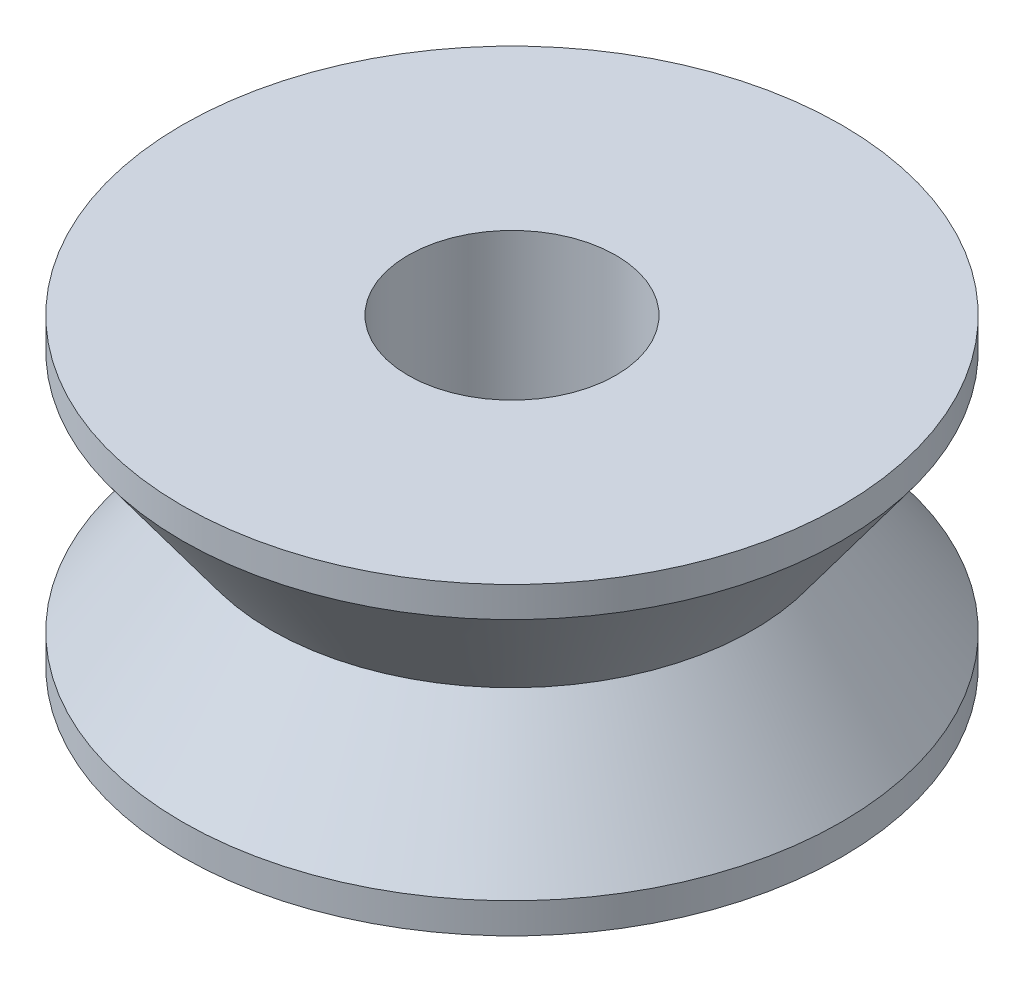
ISO-10303-21;
HEADER;
FILE_DESCRIPTION(('STEP AP214'),'2;1');
FILE_NAME('part.step','',(''),(''),'','','');
FILE_SCHEMA(('AUTOMOTIVE_DESIGN { 1 0 10303 214 1 1 1 1 }'));
ENDSEC;
DATA;
#1=APPLICATION_CONTEXT('core data for automotive mechanical design processes');
#2=APPLICATION_PROTOCOL_DEFINITION('international standard','automotive_design',2000,#1);
#3=PRODUCT_CONTEXT('',#1,'mechanical');
#4=PRODUCT('Part','Part','',(#3));
#5=PRODUCT_RELATED_PRODUCT_CATEGORY('part','',(#4));
#6=PRODUCT_DEFINITION_FORMATION('','',#4);
#7=PRODUCT_DEFINITION_CONTEXT('part definition',#1,'design');
#8=PRODUCT_DEFINITION('design','',#6,#7);
#9=PRODUCT_DEFINITION_SHAPE('','',#8);
#10=(LENGTH_UNIT() NAMED_UNIT(*) SI_UNIT(.MILLI.,.METRE.));
#11=(NAMED_UNIT(*) PLANE_ANGLE_UNIT() SI_UNIT($,.RADIAN.));
#12=(NAMED_UNIT(*) SI_UNIT($,.STERADIAN.) SOLID_ANGLE_UNIT());
#13=UNCERTAINTY_MEASURE_WITH_UNIT(LENGTH_MEASURE(1.E-05),#10,'distance_accuracy_value','');
#14=(GEOMETRIC_REPRESENTATION_CONTEXT(3) GLOBAL_UNCERTAINTY_ASSIGNED_CONTEXT((#13)) GLOBAL_UNIT_ASSIGNED_CONTEXT((#10,
#11,#12)) REPRESENTATION_CONTEXT('',''));
#15=CARTESIAN_POINT('',(0.,0.,0.));
#16=DIRECTION('',(0.,0.,1.));
#17=DIRECTION('',(1.,0.,0.));
#18=AXIS2_PLACEMENT_3D('',#15,#16,#17);
#19=CARTESIAN_POINT('',(0.,6.,0.));
#20=DIRECTION('',(0.,1.,0.));
#21=DIRECTION('',(0.,0.,1.));
#22=AXIS2_PLACEMENT_3D('',#19,#20,#21);
#23=PLANE('',#22);
#24=CARTESIAN_POINT('',(0.,6.,0.));
#25=DIRECTION('',(0.,1.,0.));
#26=DIRECTION('',(0.,0.,1.));
#27=AXIS2_PLACEMENT_3D('',#24,#25,#26);
#28=CIRCLE('',#27,2.05);
#29=CARTESIAN_POINT('',(0.,6.,2.05));
#30=VERTEX_POINT('',#29);
#31=EDGE_CURVE('E57',#30,#30,#28,.T.);
#32=ORIENTED_EDGE('',*,*,#31,.F.);
#33=EDGE_LOOP('',(#32));
#34=FACE_BOUND('',#33,.T.);
#35=CARTESIAN_POINT('',(0.,6.,0.));
#36=DIRECTION('',(0.,-1.,0.));
#37=DIRECTION('',(0.,0.,-1.));
#38=AXIS2_PLACEMENT_3D('',#35,#36,#37);
#39=CIRCLE('',#38,6.5);
#40=CARTESIAN_POINT('',(0.,6.,-6.5));
#41=VERTEX_POINT('',#40);
#42=EDGE_CURVE('E10',#41,#41,#39,.T.);
#43=ORIENTED_EDGE('',*,*,#42,.F.);
#44=EDGE_LOOP('',(#43));
#45=FACE_BOUND('',#44,.T.);
#46=ADVANCED_FACE('F35',(#34,#45),#23,.T.);
#47=CARTESIAN_POINT('',(0.,0.,0.));
#48=DIRECTION('',(0.,-1.,0.));
#49=DIRECTION('',(0.,0.,-1.));
#50=AXIS2_PLACEMENT_3D('',#47,#48,#49);
#51=CYLINDRICAL_SURFACE('',#50,6.5);
#52=ORIENTED_EDGE('',*,*,#42,.T.);
#53=EDGE_LOOP('',(#52));
#54=FACE_BOUND('',#53,.T.);
#55=CARTESIAN_POINT('',(0.,5.4,0.));
#56=DIRECTION('',(0.,-1.,0.));
#57=DIRECTION('',(0.,0.,-1.));
#58=AXIS2_PLACEMENT_3D('',#55,#56,#57);
#59=CIRCLE('',#58,6.5);
#60=CARTESIAN_POINT('',(0.,5.4,-6.5));
#61=VERTEX_POINT('',#60);
#62=EDGE_CURVE('E41',#61,#61,#59,.T.);
#63=ORIENTED_EDGE('',*,*,#62,.F.);
#64=EDGE_LOOP('',(#63));
#65=FACE_BOUND('',#64,.T.);
#66=ADVANCED_FACE('F68',(#54,#65),#51,.T.);
#67=CARTESIAN_POINT('',(0.,3.,0.));
#68=DIRECTION('',(0.,1.,0.));
#69=DIRECTION('',(0.,0.,1.));
#70=AXIS2_PLACEMENT_3D('',#67,#68,#69);
#71=CONICAL_SURFACE('',#70,4.75,0.630033909545915);
#72=ORIENTED_EDGE('',*,*,#62,.T.);
#73=EDGE_LOOP('',(#72));
#74=FACE_BOUND('',#73,.T.);
#75=CARTESIAN_POINT('',(0.,3.,0.));
#76=DIRECTION('',(0.,-1.,0.));
#77=DIRECTION('',(0.,0.,-1.));
#78=AXIS2_PLACEMENT_3D('',#75,#76,#77);
#79=CIRCLE('',#78,4.75);
#80=CARTESIAN_POINT('',(0.,3.,-4.75));
#81=VERTEX_POINT('',#80);
#82=EDGE_CURVE('E45',#81,#81,#79,.T.);
#83=ORIENTED_EDGE('',*,*,#82,.F.);
#84=EDGE_LOOP('',(#83));
#85=FACE_BOUND('',#84,.T.);
#86=ADVANCED_FACE('F72',(#74,#85),#71,.T.);
#87=CARTESIAN_POINT('',(0.,0.6,0.));
#88=DIRECTION('',(0.,-1.,0.));
#89=DIRECTION('',(0.,0.,-1.));
#90=AXIS2_PLACEMENT_3D('',#87,#88,#89);
#91=CONICAL_SURFACE('',#90,6.5,0.630033909545915);
#92=ORIENTED_EDGE('',*,*,#82,.T.);
#93=EDGE_LOOP('',(#92));
#94=FACE_BOUND('',#93,.T.);
#95=CARTESIAN_POINT('',(0.,0.6,0.));
#96=DIRECTION('',(0.,-1.,0.));
#97=DIRECTION('',(0.,0.,-1.));
#98=AXIS2_PLACEMENT_3D('',#95,#96,#97);
#99=CIRCLE('',#98,6.5);
#100=CARTESIAN_POINT('',(0.,0.6,-6.5));
#101=VERTEX_POINT('',#100);
#102=EDGE_CURVE('E49',#101,#101,#99,.T.);
#103=ORIENTED_EDGE('',*,*,#102,.F.);
#104=EDGE_LOOP('',(#103));
#105=FACE_BOUND('',#104,.T.);
#106=ADVANCED_FACE('F76',(#94,#105),#91,.T.);
#107=CARTESIAN_POINT('',(0.,0.,0.));
#108=DIRECTION('',(0.,-1.,0.));
#109=DIRECTION('',(0.,0.,-1.));
#110=AXIS2_PLACEMENT_3D('',#107,#108,#109);
#111=CYLINDRICAL_SURFACE('',#110,6.5);
#112=ORIENTED_EDGE('',*,*,#102,.T.);
#113=EDGE_LOOP('',(#112));
#114=FACE_BOUND('',#113,.T.);
#115=CARTESIAN_POINT('',(0.,0.,0.));
#116=DIRECTION('',(0.,-1.,0.));
#117=DIRECTION('',(0.,0.,-1.));
#118=AXIS2_PLACEMENT_3D('',#115,#116,#117);
#119=CIRCLE('',#118,6.5);
#120=CARTESIAN_POINT('',(0.,0.,-6.5));
#121=VERTEX_POINT('',#120);
#122=EDGE_CURVE('E54',#121,#121,#119,.T.);
#123=ORIENTED_EDGE('',*,*,#122,.F.);
#124=EDGE_LOOP('',(#123));
#125=FACE_BOUND('',#124,.T.);
#126=ADVANCED_FACE('F82',(#114,#125),#111,.T.);
#127=CARTESIAN_POINT('',(6.5,0.,0.));
#128=DIRECTION('',(0.,-1.,0.));
#129=DIRECTION('',(0.,0.,-1.));
#130=AXIS2_PLACEMENT_3D('',#127,#128,#129);
#131=PLANE('',#130);
#132=CARTESIAN_POINT('',(0.,0.,0.));
#133=DIRECTION('',(0.,-1.,0.));
#134=DIRECTION('',(0.,0.,-1.));
#135=AXIS2_PLACEMENT_3D('',#132,#133,#134);
#136=CIRCLE('',#135,2.05);
#137=CARTESIAN_POINT('',(0.,0.,2.05));
#138=VERTEX_POINT('',#137);
#139=EDGE_CURVE('E58',#138,#138,#136,.F.);
#140=ORIENTED_EDGE('',*,*,#139,.T.);
#141=EDGE_LOOP('',(#140));
#142=FACE_BOUND('',#141,.T.);
#143=ORIENTED_EDGE('',*,*,#122,.T.);
#144=EDGE_LOOP('',(#143));
#145=FACE_BOUND('',#144,.T.);
#146=ADVANCED_FACE('F86',(#142,#145),#131,.T.);
#147=CARTESIAN_POINT('',(0.,-0.00100000000000013,0.));
#148=DIRECTION('',(0.,1.,0.));
#149=DIRECTION('',(0.,0.,1.));
#150=AXIS2_PLACEMENT_3D('',#147,#148,#149);
#151=CYLINDRICAL_SURFACE('',#150,2.05);
#152=CARTESIAN_POINT('',(0.,0.,2.05));
#153=CARTESIAN_POINT('',(0.,0.0624999999999998,2.05));
#154=CARTESIAN_POINT('',(0.,0.125,2.05));
#155=CARTESIAN_POINT('',(0.,0.25,2.05));
#156=CARTESIAN_POINT('',(0.,0.3125,2.05));
#157=CARTESIAN_POINT('',(0.,0.4375,2.05));
#158=CARTESIAN_POINT('',(0.,0.5,2.05));
#159=CARTESIAN_POINT('',(0.,0.625,2.05));
#160=CARTESIAN_POINT('',(0.,0.6875,2.05));
#161=CARTESIAN_POINT('',(0.,0.8125,2.05));
#162=CARTESIAN_POINT('',(0.,0.875,2.05));
#163=CARTESIAN_POINT('',(0.,1.,2.05));
#164=CARTESIAN_POINT('',(0.,1.0625,2.05));
#165=CARTESIAN_POINT('',(0.,1.1875,2.05));
#166=CARTESIAN_POINT('',(0.,1.25,2.05));
#167=CARTESIAN_POINT('',(0.,1.375,2.05));
#168=CARTESIAN_POINT('',(0.,1.4375,2.05));
#169=CARTESIAN_POINT('',(0.,1.5625,2.05));
#170=CARTESIAN_POINT('',(0.,1.625,2.05));
#171=CARTESIAN_POINT('',(0.,1.75,2.05));
#172=CARTESIAN_POINT('',(0.,1.8125,2.05));
#173=CARTESIAN_POINT('',(0.,1.9375,2.05));
#174=CARTESIAN_POINT('',(0.,2.,2.05));
#175=CARTESIAN_POINT('',(0.,2.125,2.05));
#176=CARTESIAN_POINT('',(0.,2.1875,2.05));
#177=CARTESIAN_POINT('',(0.,2.3125,2.05));
#178=CARTESIAN_POINT('',(0.,2.375,2.05));
#179=CARTESIAN_POINT('',(0.,2.5,2.05));
#180=CARTESIAN_POINT('',(0.,2.5625,2.05));
#181=CARTESIAN_POINT('',(0.,2.6875,2.05));
#182=CARTESIAN_POINT('',(0.,2.75,2.05));
#183=CARTESIAN_POINT('',(0.,2.875,2.05));
#184=CARTESIAN_POINT('',(0.,2.9375,2.05));
#185=CARTESIAN_POINT('',(0.,3.0625,2.05));
#186=CARTESIAN_POINT('',(0.,3.125,2.05));
#187=CARTESIAN_POINT('',(0.,3.25,2.05));
#188=CARTESIAN_POINT('',(0.,3.3125,2.05));
#189=CARTESIAN_POINT('',(0.,3.4375,2.05));
#190=CARTESIAN_POINT('',(0.,3.5,2.05));
#191=CARTESIAN_POINT('',(0.,3.625,2.05));
#192=CARTESIAN_POINT('',(0.,3.6875,2.05));
#193=CARTESIAN_POINT('',(0.,3.8125,2.05));
#194=CARTESIAN_POINT('',(0.,3.875,2.05));
#195=CARTESIAN_POINT('',(0.,4.,2.05));
#196=CARTESIAN_POINT('',(0.,4.0625,2.05));
#197=CARTESIAN_POINT('',(0.,4.1875,2.05));
#198=CARTESIAN_POINT('',(0.,4.25,2.05));
#199=CARTESIAN_POINT('',(0.,4.375,2.05));
#200=CARTESIAN_POINT('',(0.,4.4375,2.05));
#201=CARTESIAN_POINT('',(0.,4.5625,2.05));
#202=CARTESIAN_POINT('',(0.,4.625,2.05));
#203=CARTESIAN_POINT('',(0.,4.75,2.05));
#204=CARTESIAN_POINT('',(0.,4.8125,2.05));
#205=CARTESIAN_POINT('',(0.,4.9375,2.05));
#206=CARTESIAN_POINT('',(0.,5.,2.05));
#207=CARTESIAN_POINT('',(0.,5.125,2.05));
#208=CARTESIAN_POINT('',(0.,5.1875,2.05));
#209=CARTESIAN_POINT('',(0.,5.3125,2.05));
#210=CARTESIAN_POINT('',(0.,5.375,2.05));
#211=CARTESIAN_POINT('',(0.,5.5,2.05));
#212=CARTESIAN_POINT('',(0.,5.5625,2.05));
#213=CARTESIAN_POINT('',(0.,5.6875,2.05));
#214=CARTESIAN_POINT('',(0.,5.75,2.05));
#215=CARTESIAN_POINT('',(0.,5.875,2.05));
#216=CARTESIAN_POINT('',(0.,5.9375,2.05));
#217=CARTESIAN_POINT('',(0.,6.,2.05));
#218=B_SPLINE_CURVE_WITH_KNOTS('',3,(#152,#153,#154,#155,#156,#157,#158,#159,#160,#161,#162,
#163,#164,#165,#166,#167,#168,#169,#170,#171,#172,#173,#174,#175,#176,#177,#178,#179,#180,#181,
#182,#183,#184,#185,#186,#187,#188,#189,#190,#191,#192,#193,#194,#195,#196,#197,#198,#199,#200,
#201,#202,#203,#204,#205,#206,#207,#208,#209,#210,#211,#212,#213,#214,#215,#216,#217),
.UNSPECIFIED.,.F.,.F.,(4,2,2,2,2,2,2,2,2,2,2,2,2,2,2,2,2,2,2,2,2,2,2,2,2,2,2,2,2,2,2,2,4),(0.,
0.1875,0.375,0.5625,0.75,0.9375,1.125,1.3125,1.5,1.6875,1.875,2.0625,2.25,2.4375,2.625,2.8125,
3.,3.1875,3.375,3.5625,3.75,3.9375,4.125,4.3125,4.5,4.6875,4.875,5.0625,5.25,5.4375,5.625,
5.8125,6.),.UNSPECIFIED.);
#219=EDGE_CURVE('BSEAM64',#138,#30,#218,.T.);
#220=ORIENTED_EDGE('',*,*,#139,.F.);
#221=ORIENTED_EDGE('',*,*,#31,.T.);
#222=ORIENTED_EDGE('',*,*,#219,.T.);
#223=ORIENTED_EDGE('',*,*,#219,.F.);
#224=EDGE_LOOP('',(#220,#222,#221,#223));
#225=FACE_BOUND('',#224,.T.);
#226=ADVANCED_FACE('F64',(#225),#151,.F.);
#227=CLOSED_SHELL('',(#46,#66,#86,#106,#126,#146,#226));
#228=MANIFOLD_SOLID_BREP('B2',#227);
#229=ADVANCED_BREP_SHAPE_REPRESENTATION('',(#18,#228),#14);
#230=SHAPE_DEFINITION_REPRESENTATION(#9,#229);
ENDSEC;
END-ISO-10303-21;
